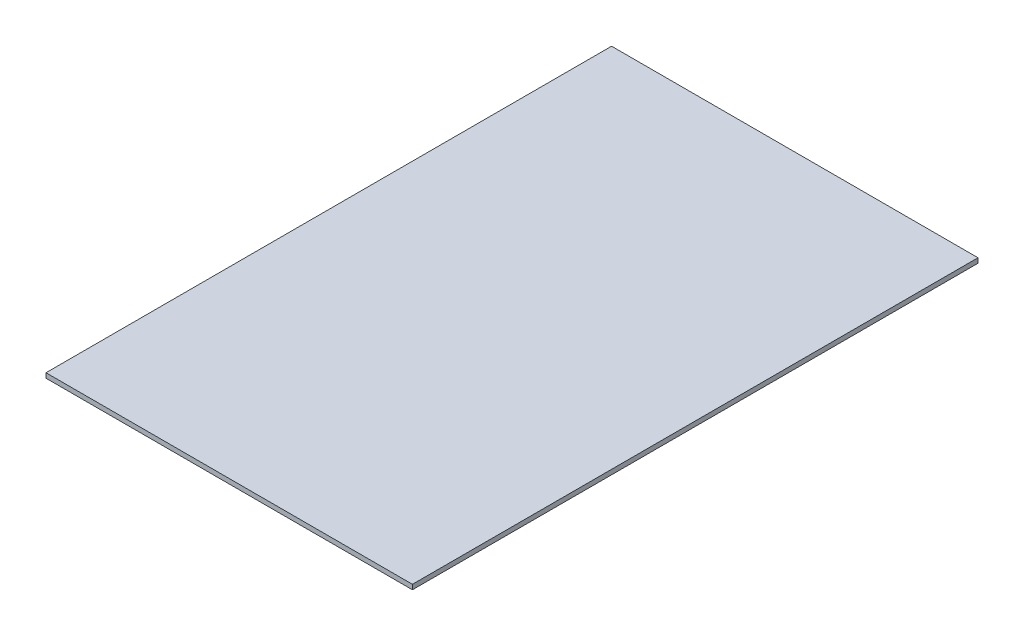
ISO-10303-21;
HEADER;
FILE_DESCRIPTION(('STEP AP214'),'2;1');
FILE_NAME('part.step','',(''),(''),'','','');
FILE_SCHEMA(('AUTOMOTIVE_DESIGN { 1 0 10303 214 1 1 1 1 }'));
ENDSEC;
DATA;
#1=APPLICATION_CONTEXT('core data for automotive mechanical design processes');
#2=APPLICATION_PROTOCOL_DEFINITION('international standard','automotive_design',2000,#1);
#3=PRODUCT_CONTEXT('',#1,'mechanical');
#4=PRODUCT('Part','Part','',(#3));
#5=PRODUCT_RELATED_PRODUCT_CATEGORY('part','',(#4));
#6=PRODUCT_DEFINITION_FORMATION('','',#4);
#7=PRODUCT_DEFINITION_CONTEXT('part definition',#1,'design');
#8=PRODUCT_DEFINITION('design','',#6,#7);
#9=PRODUCT_DEFINITION_SHAPE('','',#8);
#10=(LENGTH_UNIT() NAMED_UNIT(*) SI_UNIT(.MILLI.,.METRE.));
#11=(NAMED_UNIT(*) PLANE_ANGLE_UNIT() SI_UNIT($,.RADIAN.));
#12=(NAMED_UNIT(*) SI_UNIT($,.STERADIAN.) SOLID_ANGLE_UNIT());
#13=UNCERTAINTY_MEASURE_WITH_UNIT(LENGTH_MEASURE(1.E-05),#10,'distance_accuracy_value','');
#14=(GEOMETRIC_REPRESENTATION_CONTEXT(3) GLOBAL_UNCERTAINTY_ASSIGNED_CONTEXT((#13)) GLOBAL_UNIT_ASSIGNED_CONTEXT((#10,
#11,#12)) REPRESENTATION_CONTEXT('',''));
#15=CARTESIAN_POINT('',(0.,0.,0.));
#16=DIRECTION('',(0.,0.,1.));
#17=DIRECTION('',(1.,0.,0.));
#18=AXIS2_PLACEMENT_3D('',#15,#16,#17);
#19=CARTESIAN_POINT('',(0.,0.,0.));
#20=DIRECTION('',(0.,-1.,0.));
#21=DIRECTION('',(0.,0.,-1.));
#22=AXIS2_PLACEMENT_3D('',#19,#20,#21);
#23=PLANE('',#22);
#24=DIRECTION('',(0.,0.,-1.));
#25=VECTOR('',#24,1.);
#26=CARTESIAN_POINT('',(-17.25,0.,26.625));
#27=LINE('',#26,#25);
#28=CARTESIAN_POINT('',(-17.25,0.,26.625));
#29=VERTEX_POINT('',#28);
#30=CARTESIAN_POINT('',(-17.25,0.,-26.625));
#31=VERTEX_POINT('',#30);
#32=EDGE_CURVE('E55',#29,#31,#27,.T.);
#33=ORIENTED_EDGE('',*,*,#32,.T.);
#34=DIRECTION('',(1.,0.,0.));
#35=VECTOR('',#34,1.);
#36=CARTESIAN_POINT('',(-17.25,0.,-26.625));
#37=LINE('',#36,#35);
#38=CARTESIAN_POINT('',(17.25,0.,-26.625));
#39=VERTEX_POINT('',#38);
#40=EDGE_CURVE('E76',#31,#39,#37,.T.);
#41=ORIENTED_EDGE('',*,*,#40,.T.);
#42=DIRECTION('',(0.,0.,1.));
#43=VECTOR('',#42,1.);
#44=CARTESIAN_POINT('',(17.25,0.,26.625));
#45=LINE('',#44,#43);
#46=CARTESIAN_POINT('',(17.25,0.,26.625));
#47=VERTEX_POINT('',#46);
#48=EDGE_CURVE('E58',#39,#47,#45,.T.);
#49=ORIENTED_EDGE('',*,*,#48,.T.);
#50=DIRECTION('',(-1.,0.,0.));
#51=VECTOR('',#50,1.);
#52=CARTESIAN_POINT('',(-17.25,0.,26.625));
#53=LINE('',#52,#51);
#54=EDGE_CURVE('E20',#47,#29,#53,.T.);
#55=ORIENTED_EDGE('',*,*,#54,.T.);
#56=EDGE_LOOP('',(#33,#41,#49,#55));
#57=FACE_BOUND('',#56,.T.);
#58=ADVANCED_FACE('F17',(#57),#23,.T.);
#59=CARTESIAN_POINT('',(-17.25,0.45,26.625));
#60=DIRECTION('',(0.,0.,-1.));
#61=DIRECTION('',(-1.,0.,0.));
#62=AXIS2_PLACEMENT_3D('',#59,#60,#61);
#63=PLANE('',#62);
#64=DIRECTION('',(0.,1.,0.));
#65=VECTOR('',#64,1.);
#66=CARTESIAN_POINT('',(17.25,0.45,26.625));
#67=LINE('',#66,#65);
#68=CARTESIAN_POINT('',(17.25,0.45,26.625));
#69=VERTEX_POINT('',#68);
#70=EDGE_CURVE('E78',#47,#69,#67,.T.);
#71=ORIENTED_EDGE('',*,*,#70,.T.);
#72=DIRECTION('',(1.,0.,0.));
#73=VECTOR('',#72,1.);
#74=CARTESIAN_POINT('',(0.,0.45,26.625));
#75=LINE('',#74,#73);
#76=CARTESIAN_POINT('',(-17.25,0.45,26.625));
#77=VERTEX_POINT('',#76);
#78=EDGE_CURVE('E73',#69,#77,#75,.F.);
#79=ORIENTED_EDGE('',*,*,#78,.T.);
#80=DIRECTION('',(0.,1.,0.));
#81=VECTOR('',#80,1.);
#82=CARTESIAN_POINT('',(-17.25,0.45,26.625));
#83=LINE('',#82,#81);
#84=EDGE_CURVE('E63',#77,#29,#83,.F.);
#85=ORIENTED_EDGE('',*,*,#84,.T.);
#86=ORIENTED_EDGE('',*,*,#54,.F.);
#87=EDGE_LOOP('',(#71,#79,#85,#86));
#88=FACE_BOUND('',#87,.T.);
#89=ADVANCED_FACE('F72',(#88),#63,.F.);
#90=CARTESIAN_POINT('',(-17.25,0.45,26.625));
#91=DIRECTION('',(1.,0.,0.));
#92=DIRECTION('',(0.,0.,-1.));
#93=AXIS2_PLACEMENT_3D('',#90,#91,#92);
#94=PLANE('',#93);
#95=ORIENTED_EDGE('',*,*,#84,.F.);
#96=DIRECTION('',(0.,0.,-1.));
#97=VECTOR('',#96,1.);
#98=CARTESIAN_POINT('',(-17.25,0.45,0.));
#99=LINE('',#98,#97);
#100=CARTESIAN_POINT('',(-17.25,0.45,-26.625));
#101=VERTEX_POINT('',#100);
#102=EDGE_CURVE('E83',#77,#101,#99,.T.);
#103=ORIENTED_EDGE('',*,*,#102,.T.);
#104=DIRECTION('',(0.,1.,0.));
#105=VECTOR('',#104,1.);
#106=CARTESIAN_POINT('',(-17.25,0.45,-26.625));
#107=LINE('',#106,#105);
#108=EDGE_CURVE('E69',#101,#31,#107,.F.);
#109=ORIENTED_EDGE('',*,*,#108,.T.);
#110=ORIENTED_EDGE('',*,*,#32,.F.);
#111=EDGE_LOOP('',(#95,#103,#109,#110));
#112=FACE_BOUND('',#111,.T.);
#113=ADVANCED_FACE('F66',(#112),#94,.F.);
#114=CARTESIAN_POINT('',(-17.25,0.45,-26.625));
#115=DIRECTION('',(0.,0.,1.));
#116=DIRECTION('',(1.,0.,0.));
#117=AXIS2_PLACEMENT_3D('',#114,#115,#116);
#118=PLANE('',#117);
#119=ORIENTED_EDGE('',*,*,#108,.F.);
#120=DIRECTION('',(1.,0.,0.));
#121=VECTOR('',#120,1.);
#122=CARTESIAN_POINT('',(0.,0.45,-26.625));
#123=LINE('',#122,#121);
#124=CARTESIAN_POINT('',(17.25,0.45,-26.625));
#125=VERTEX_POINT('',#124);
#126=EDGE_CURVE('E26',#101,#125,#123,.T.);
#127=ORIENTED_EDGE('',*,*,#126,.T.);
#128=DIRECTION('',(0.,1.,0.));
#129=VECTOR('',#128,1.);
#130=CARTESIAN_POINT('',(17.25,0.45,-26.625));
#131=LINE('',#130,#129);
#132=EDGE_CURVE('E34',#125,#39,#131,.F.);
#133=ORIENTED_EDGE('',*,*,#132,.T.);
#134=ORIENTED_EDGE('',*,*,#40,.F.);
#135=EDGE_LOOP('',(#119,#127,#133,#134));
#136=FACE_BOUND('',#135,.T.);
#137=ADVANCED_FACE('F88',(#136),#118,.F.);
#138=CARTESIAN_POINT('',(17.25,0.45,26.625));
#139=DIRECTION('',(-1.,0.,0.));
#140=DIRECTION('',(0.,0.,1.));
#141=AXIS2_PLACEMENT_3D('',#138,#139,#140);
#142=PLANE('',#141);
#143=ORIENTED_EDGE('',*,*,#132,.F.);
#144=DIRECTION('',(0.,0.,-1.));
#145=VECTOR('',#144,1.);
#146=CARTESIAN_POINT('',(17.25,0.45,0.));
#147=LINE('',#146,#145);
#148=EDGE_CURVE('E11',#125,#69,#147,.F.);
#149=ORIENTED_EDGE('',*,*,#148,.T.);
#150=ORIENTED_EDGE('',*,*,#70,.F.);
#151=ORIENTED_EDGE('',*,*,#48,.F.);
#152=EDGE_LOOP('',(#143,#149,#150,#151));
#153=FACE_BOUND('',#152,.T.);
#154=ADVANCED_FACE('F91',(#153),#142,.F.);
#155=CARTESIAN_POINT('',(0.,0.45,0.));
#156=DIRECTION('',(0.,-1.,0.));
#157=DIRECTION('',(0.,0.,-1.));
#158=AXIS2_PLACEMENT_3D('',#155,#156,#157);
#159=PLANE('',#158);
#160=ORIENTED_EDGE('',*,*,#126,.F.);
#161=ORIENTED_EDGE('',*,*,#102,.F.);
#162=ORIENTED_EDGE('',*,*,#78,.F.);
#163=ORIENTED_EDGE('',*,*,#148,.F.);
#164=EDGE_LOOP('',(#160,#161,#162,#163));
#165=FACE_BOUND('',#164,.T.);
#166=ADVANCED_FACE('F90',(#165),#159,.F.);
#167=CLOSED_SHELL('',(#58,#89,#113,#137,#154,#166));
#168=MANIFOLD_SOLID_BREP('B1',#167);
#169=ADVANCED_BREP_SHAPE_REPRESENTATION('',(#18,#168),#14);
#170=SHAPE_DEFINITION_REPRESENTATION(#9,#169);
ENDSEC;
END-ISO-10303-21;
